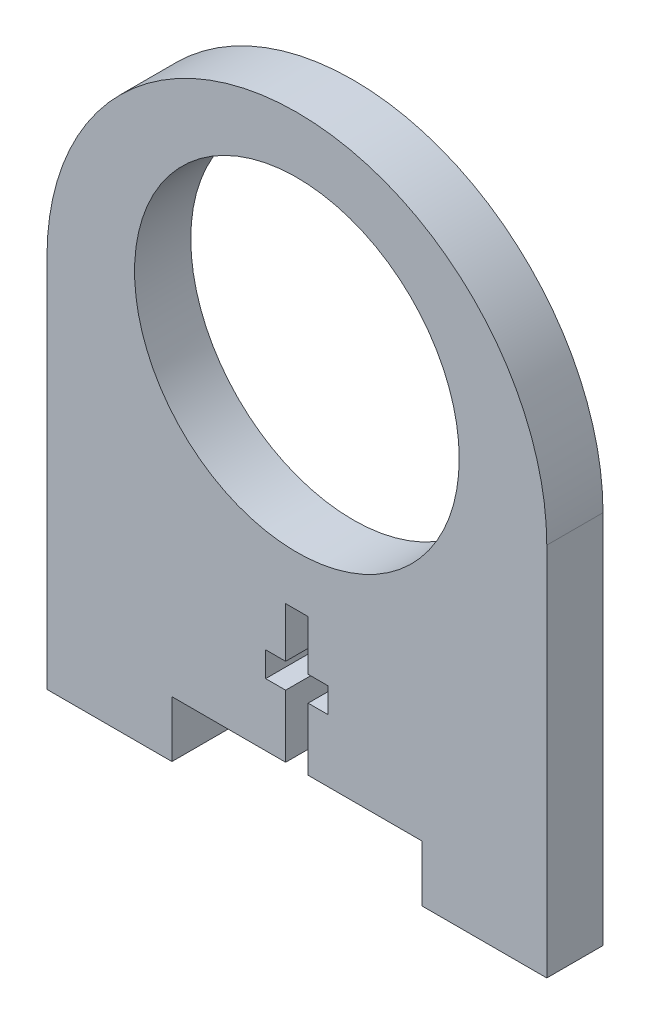
ISO-10303-21;
HEADER;
FILE_DESCRIPTION(('STEP AP214'),'2;1');
FILE_NAME('part.step','',(''),(''),'','','');
FILE_SCHEMA(('AUTOMOTIVE_DESIGN { 1 0 10303 214 1 1 1 1 }'));
ENDSEC;
DATA;
#1=APPLICATION_CONTEXT('core data for automotive mechanical design processes');
#2=APPLICATION_PROTOCOL_DEFINITION('international standard','automotive_design',2000,#1);
#3=PRODUCT_CONTEXT('',#1,'mechanical');
#4=PRODUCT('Part','Part','',(#3));
#5=PRODUCT_RELATED_PRODUCT_CATEGORY('part','',(#4));
#6=PRODUCT_DEFINITION_FORMATION('','',#4);
#7=PRODUCT_DEFINITION_CONTEXT('part definition',#1,'design');
#8=PRODUCT_DEFINITION('design','',#6,#7);
#9=PRODUCT_DEFINITION_SHAPE('','',#8);
#10=(LENGTH_UNIT() NAMED_UNIT(*) SI_UNIT(.MILLI.,.METRE.));
#11=(NAMED_UNIT(*) PLANE_ANGLE_UNIT() SI_UNIT($,.RADIAN.));
#12=(NAMED_UNIT(*) SI_UNIT($,.STERADIAN.) SOLID_ANGLE_UNIT());
#13=UNCERTAINTY_MEASURE_WITH_UNIT(LENGTH_MEASURE(1.E-05),#10,'distance_accuracy_value','');
#14=(GEOMETRIC_REPRESENTATION_CONTEXT(3) GLOBAL_UNCERTAINTY_ASSIGNED_CONTEXT((#13)) GLOBAL_UNIT_ASSIGNED_CONTEXT((#10,
#11,#12)) REPRESENTATION_CONTEXT('',''));
#15=CARTESIAN_POINT('',(0.,0.,0.));
#16=DIRECTION('',(0.,0.,1.));
#17=DIRECTION('',(1.,0.,0.));
#18=AXIS2_PLACEMENT_3D('',#15,#16,#17);
#19=CARTESIAN_POINT('',(-12.7,-13.335,-0.00100000000000013));
#20=DIRECTION('',(0.,1.,0.));
#21=DIRECTION('',(0.,0.,1.));
#22=AXIS2_PLACEMENT_3D('',#19,#20,#21);
#23=PLANE('',#22);
#24=DIRECTION('',(-1.,0.,0.));
#25=VECTOR('',#24,1.);
#26=CARTESIAN_POINT('',(-12.7,-13.335,5.715));
#27=LINE('',#26,#25);
#28=CARTESIAN_POINT('',(12.7,-13.335,5.715));
#29=VERTEX_POINT('',#28);
#30=CARTESIAN_POINT('',(1.14300000000002,-13.335,5.715));
#31=VERTEX_POINT('',#30);
#32=EDGE_CURVE('E190',#29,#31,#27,.T.);
#33=ORIENTED_EDGE('',*,*,#32,.T.);
#34=DIRECTION('',(0.,0.,1.));
#35=VECTOR('',#34,1.);
#36=CARTESIAN_POINT('',(1.14300000000002,-13.335,-0.00100000000000013));
#37=LINE('',#36,#35);
#38=CARTESIAN_POINT('',(1.14300000000002,-13.335,0.));
#39=VERTEX_POINT('',#38);
#40=EDGE_CURVE('E176',#39,#31,#37,.T.);
#41=ORIENTED_EDGE('',*,*,#40,.F.);
#42=DIRECTION('',(-1.,0.,0.));
#43=VECTOR('',#42,1.);
#44=CARTESIAN_POINT('',(-12.7,-13.335,0.));
#45=LINE('',#44,#43);
#46=CARTESIAN_POINT('',(12.7,-13.335,0.));
#47=VERTEX_POINT('',#46);
#48=EDGE_CURVE('E187',#47,#39,#45,.T.);
#49=ORIENTED_EDGE('',*,*,#48,.F.);
#50=DIRECTION('',(0.,0.,1.));
#51=VECTOR('',#50,1.);
#52=CARTESIAN_POINT('',(12.7,-13.335,-0.00100000000000013));
#53=LINE('',#52,#51);
#54=EDGE_CURVE('E58',#47,#29,#53,.T.);
#55=ORIENTED_EDGE('',*,*,#54,.T.);
#56=EDGE_LOOP('',(#33,#41,#49,#55));
#57=FACE_BOUND('',#56,.T.);
#58=ADVANCED_FACE('F35',(#57),#23,.F.);
#59=CARTESIAN_POINT('',(25.4,-19.05,5.715));
#60=DIRECTION('',(0.,1.,0.));
#61=DIRECTION('',(-1.,0.,0.));
#62=AXIS2_PLACEMENT_3D('',#59,#60,#61);
#63=PLANE('',#62);
#64=DIRECTION('',(1.,0.,0.));
#65=VECTOR('',#64,1.);
#66=CARTESIAN_POINT('',(25.4,-19.05,0.));
#67=LINE('',#66,#65);
#68=CARTESIAN_POINT('',(-25.4,-19.05,0.));
#69=VERTEX_POINT('',#68);
#70=CARTESIAN_POINT('',(-12.7,-19.05,0.));
#71=VERTEX_POINT('',#70);
#72=EDGE_CURVE('E245',#69,#71,#67,.T.);
#73=ORIENTED_EDGE('',*,*,#72,.T.);
#74=DIRECTION('',(0.,0.,1.));
#75=VECTOR('',#74,1.);
#76=CARTESIAN_POINT('',(-12.7,-19.05,-0.00100000000000013));
#77=LINE('',#76,#75);
#78=CARTESIAN_POINT('',(-12.7,-19.05,5.715));
#79=VERTEX_POINT('',#78);
#80=EDGE_CURVE('E211',#71,#79,#77,.T.);
#81=ORIENTED_EDGE('',*,*,#80,.T.);
#82=DIRECTION('',(1.,0.,0.));
#83=VECTOR('',#82,1.);
#84=CARTESIAN_POINT('',(25.4,-19.05,5.715));
#85=LINE('',#84,#83);
#86=CARTESIAN_POINT('',(-25.4,-19.05,5.715));
#87=VERTEX_POINT('',#86);
#88=EDGE_CURVE('E234',#87,#79,#85,.T.);
#89=ORIENTED_EDGE('',*,*,#88,.F.);
#90=DIRECTION('',(0.,0.,-1.));
#91=VECTOR('',#90,1.);
#92=CARTESIAN_POINT('',(-25.4,-19.05,5.715));
#93=LINE('',#92,#91);
#94=EDGE_CURVE('E43',#87,#69,#93,.T.);
#95=ORIENTED_EDGE('',*,*,#94,.T.);
#96=EDGE_LOOP('',(#73,#81,#89,#95));
#97=FACE_BOUND('',#96,.T.);
#98=ADVANCED_FACE('F258',(#97),#63,.F.);
#99=CARTESIAN_POINT('',(0.,19.05,5.715));
#100=DIRECTION('',(0.,0.,-1.));
#101=DIRECTION('',(-1.,0.,0.));
#102=AXIS2_PLACEMENT_3D('',#99,#100,#101);
#103=CYLINDRICAL_SURFACE('',#102,25.4);
#104=CARTESIAN_POINT('',(0.,19.05,0.));
#105=DIRECTION('',(0.,0.,1.));
#106=DIRECTION('',(-1.,0.,0.));
#107=AXIS2_PLACEMENT_3D('',#104,#105,#106);
#108=CIRCLE('',#107,25.4);
#109=CARTESIAN_POINT('',(25.4,19.05,0.));
#110=VERTEX_POINT('',#109);
#111=CARTESIAN_POINT('',(-25.4,19.05,0.));
#112=VERTEX_POINT('',#111);
#113=EDGE_CURVE('E224',#110,#112,#108,.T.);
#114=ORIENTED_EDGE('',*,*,#113,.T.);
#115=DIRECTION('',(0.,0.,-1.));
#116=VECTOR('',#115,1.);
#117=CARTESIAN_POINT('',(-25.4,19.05,5.715));
#118=LINE('',#117,#116);
#119=CARTESIAN_POINT('',(-25.4,19.05,5.715));
#120=VERTEX_POINT('',#119);
#121=EDGE_CURVE('E11',#120,#112,#118,.T.);
#122=ORIENTED_EDGE('',*,*,#121,.F.);
#123=CARTESIAN_POINT('',(0.,19.05,5.715));
#124=DIRECTION('',(0.,0.,1.));
#125=DIRECTION('',(-1.,0.,0.));
#126=AXIS2_PLACEMENT_3D('',#123,#124,#125);
#127=CIRCLE('',#126,25.4);
#128=CARTESIAN_POINT('',(25.4,19.05,5.715));
#129=VERTEX_POINT('',#128);
#130=EDGE_CURVE('E227',#129,#120,#127,.T.);
#131=ORIENTED_EDGE('',*,*,#130,.F.);
#132=DIRECTION('',(0.,0.,-1.));
#133=VECTOR('',#132,1.);
#134=CARTESIAN_POINT('',(25.4,19.05,5.715));
#135=LINE('',#134,#133);
#136=EDGE_CURVE('E239',#129,#110,#135,.T.);
#137=ORIENTED_EDGE('',*,*,#136,.T.);
#138=EDGE_LOOP('',(#114,#122,#131,#137));
#139=FACE_BOUND('',#138,.T.);
#140=ADVANCED_FACE('F37',(#139),#103,.T.);
#141=CARTESIAN_POINT('',(-25.4,-19.05,5.715));
#142=DIRECTION('',(1.,0.,0.));
#143=DIRECTION('',(0.,1.,0.));
#144=AXIS2_PLACEMENT_3D('',#141,#142,#143);
#145=PLANE('',#144);
#146=DIRECTION('',(0.,-1.,0.));
#147=VECTOR('',#146,1.);
#148=CARTESIAN_POINT('',(-25.4,-19.05,0.));
#149=LINE('',#148,#147);
#150=EDGE_CURVE('E242',#112,#69,#149,.T.);
#151=ORIENTED_EDGE('',*,*,#150,.T.);
#152=ORIENTED_EDGE('',*,*,#94,.F.);
#153=DIRECTION('',(0.,-1.,0.));
#154=VECTOR('',#153,1.);
#155=CARTESIAN_POINT('',(-25.4,-19.05,5.715));
#156=LINE('',#155,#154);
#157=EDGE_CURVE('E230',#120,#87,#156,.T.);
#158=ORIENTED_EDGE('',*,*,#157,.F.);
#159=ORIENTED_EDGE('',*,*,#121,.T.);
#160=EDGE_LOOP('',(#151,#152,#158,#159));
#161=FACE_BOUND('',#160,.T.);
#162=ADVANCED_FACE('F277',(#161),#145,.F.);
#163=CARTESIAN_POINT('',(12.7,-19.05,5.715));
#164=VERTEX_POINT('',#163);
#165=CARTESIAN_POINT('',(25.4,-19.05,5.715));
#166=VERTEX_POINT('',#165);
#167=EDGE_CURVE('E233',#164,#166,#85,.T.);
#168=ORIENTED_EDGE('',*,*,#167,.F.);
#169=DIRECTION('',(0.,0.,1.));
#170=VECTOR('',#169,1.);
#171=CARTESIAN_POINT('',(12.7,-19.05,-0.00100000000000013));
#172=LINE('',#171,#170);
#173=CARTESIAN_POINT('',(12.7,-19.05,0.));
#174=VERTEX_POINT('',#173);
#175=EDGE_CURVE('E217',#174,#164,#172,.T.);
#176=ORIENTED_EDGE('',*,*,#175,.F.);
#177=CARTESIAN_POINT('',(25.4,-19.05,0.));
#178=VERTEX_POINT('',#177);
#179=EDGE_CURVE('E244',#174,#178,#67,.T.);
#180=ORIENTED_EDGE('',*,*,#179,.T.);
#181=DIRECTION('',(0.,0.,-1.));
#182=VECTOR('',#181,1.);
#183=CARTESIAN_POINT('',(25.4,-19.05,5.715));
#184=LINE('',#183,#182);
#185=EDGE_CURVE('E251',#166,#178,#184,.T.);
#186=ORIENTED_EDGE('',*,*,#185,.F.);
#187=EDGE_LOOP('',(#168,#176,#180,#186));
#188=FACE_BOUND('',#187,.T.);
#189=ADVANCED_FACE('F287',(#188),#63,.F.);
#190=CARTESIAN_POINT('',(25.4,-19.05,5.715));
#191=DIRECTION('',(-1.,0.,0.));
#192=DIRECTION('',(0.,0.,1.));
#193=AXIS2_PLACEMENT_3D('',#190,#191,#192);
#194=PLANE('',#193);
#195=DIRECTION('',(0.,1.,0.));
#196=VECTOR('',#195,1.);
#197=CARTESIAN_POINT('',(25.4,-19.05,0.));
#198=LINE('',#197,#196);
#199=EDGE_CURVE('E231',#178,#110,#198,.T.);
#200=ORIENTED_EDGE('',*,*,#199,.T.);
#201=ORIENTED_EDGE('',*,*,#136,.F.);
#202=DIRECTION('',(0.,1.,0.));
#203=VECTOR('',#202,1.);
#204=CARTESIAN_POINT('',(25.4,-19.05,5.715));
#205=LINE('',#204,#203);
#206=EDGE_CURVE('E237',#166,#129,#205,.T.);
#207=ORIENTED_EDGE('',*,*,#206,.F.);
#208=ORIENTED_EDGE('',*,*,#185,.T.);
#209=EDGE_LOOP('',(#200,#201,#207,#208));
#210=FACE_BOUND('',#209,.T.);
#211=ADVANCED_FACE('F282',(#210),#194,.F.);
#212=CARTESIAN_POINT('',(0.,19.05,5.715));
#213=DIRECTION('',(0.,0.,-1.));
#214=DIRECTION('',(-1.,0.,0.));
#215=AXIS2_PLACEMENT_3D('',#212,#213,#214);
#216=PLANE('',#215);
#217=CARTESIAN_POINT('',(0.,22.21484,5.715));
#218=DIRECTION('',(0.,0.,1.));
#219=DIRECTION('',(1.,0.,0.));
#220=AXIS2_PLACEMENT_3D('',#217,#218,#219);
#221=CIRCLE('',#220,16.5);
#222=CARTESIAN_POINT('',(16.5,22.21484,5.715));
#223=VERTEX_POINT('',#222);
#224=EDGE_CURVE('E221',#223,#223,#221,.T.);
#225=ORIENTED_EDGE('',*,*,#224,.F.);
#226=EDGE_LOOP('',(#225));
#227=FACE_BOUND('',#226,.T.);
#228=DIRECTION('',(1.,0.,0.));
#229=VECTOR('',#228,1.);
#230=CARTESIAN_POINT('',(3.175,-6.985,5.715));
#231=LINE('',#230,#229);
#232=CARTESIAN_POINT('',(1.143,-6.985,5.715));
#233=VERTEX_POINT('',#232);
#234=CARTESIAN_POINT('',(3.175,-6.985,5.715));
#235=VERTEX_POINT('',#234);
#236=EDGE_CURVE('E294',#233,#235,#231,.T.);
#237=ORIENTED_EDGE('',*,*,#236,.F.);
#238=DIRECTION('',(0.,1.,0.));
#239=VECTOR('',#238,1.);
#240=CARTESIAN_POINT('',(1.14300000000002,-13.335,5.715));
#241=LINE('',#240,#239);
#242=EDGE_CURVE('E291',#31,#233,#241,.T.);
#243=ORIENTED_EDGE('',*,*,#242,.F.);
#244=ORIENTED_EDGE('',*,*,#32,.F.);
#245=DIRECTION('',(0.,1.,0.));
#246=VECTOR('',#245,1.);
#247=CARTESIAN_POINT('',(12.7,-19.05,5.715));
#248=LINE('',#247,#246);
#249=EDGE_CURVE('E207',#164,#29,#248,.T.);
#250=ORIENTED_EDGE('',*,*,#249,.F.);
#251=ORIENTED_EDGE('',*,*,#167,.T.);
#252=ORIENTED_EDGE('',*,*,#206,.T.);
#253=ORIENTED_EDGE('',*,*,#130,.T.);
#254=ORIENTED_EDGE('',*,*,#157,.T.);
#255=ORIENTED_EDGE('',*,*,#88,.T.);
#256=DIRECTION('',(0.,-1.,0.));
#257=VECTOR('',#256,1.);
#258=CARTESIAN_POINT('',(-12.7,-19.05,5.715));
#259=LINE('',#258,#257);
#260=CARTESIAN_POINT('',(-12.7,-13.335,5.715));
#261=VERTEX_POINT('',#260);
#262=EDGE_CURVE('E201',#261,#79,#259,.T.);
#263=ORIENTED_EDGE('',*,*,#262,.F.);
#264=CARTESIAN_POINT('',(-1.14300000000001,-13.335,5.715));
#265=VERTEX_POINT('',#264);
#266=EDGE_CURVE('E209',#265,#261,#27,.T.);
#267=ORIENTED_EDGE('',*,*,#266,.F.);
#268=DIRECTION('',(0.,-1.,0.));
#269=VECTOR('',#268,1.);
#270=CARTESIAN_POINT('',(-1.14300000000001,-13.335,5.715));
#271=LINE('',#270,#269);
#272=CARTESIAN_POINT('',(-1.14300000000001,-6.985,5.715));
#273=VERTEX_POINT('',#272);
#274=EDGE_CURVE('E50',#273,#265,#271,.T.);
#275=ORIENTED_EDGE('',*,*,#274,.F.);
#276=DIRECTION('',(1.,0.,0.));
#277=VECTOR('',#276,1.);
#278=CARTESIAN_POINT('',(-1.14300000000001,-6.985,5.715));
#279=LINE('',#278,#277);
#280=CARTESIAN_POINT('',(-3.175,-6.985,5.715));
#281=VERTEX_POINT('',#280);
#282=EDGE_CURVE('E298',#281,#273,#279,.T.);
#283=ORIENTED_EDGE('',*,*,#282,.F.);
#284=DIRECTION('',(0.,-1.,0.));
#285=VECTOR('',#284,1.);
#286=CARTESIAN_POINT('',(-3.175,-6.985,5.715));
#287=LINE('',#286,#285);
#288=CARTESIAN_POINT('',(-3.175,-4.445,5.715));
#289=VERTEX_POINT('',#288);
#290=EDGE_CURVE('E354',#289,#281,#287,.T.);
#291=ORIENTED_EDGE('',*,*,#290,.F.);
#292=DIRECTION('',(-1.,0.,0.));
#293=VECTOR('',#292,1.);
#294=CARTESIAN_POINT('',(-1.14300000000001,-4.445,5.715));
#295=LINE('',#294,#293);
#296=CARTESIAN_POINT('',(-1.14300000000001,-4.445,5.715));
#297=VERTEX_POINT('',#296);
#298=EDGE_CURVE('E182',#297,#289,#295,.T.);
#299=ORIENTED_EDGE('',*,*,#298,.F.);
#300=DIRECTION('',(0.,-1.,0.));
#301=VECTOR('',#300,1.);
#302=CARTESIAN_POINT('',(-1.14300000000001,-4.445,5.715));
#303=LINE('',#302,#301);
#304=CARTESIAN_POINT('',(-1.14300000000001,0.635000000000004,5.715));
#305=VERTEX_POINT('',#304);
#306=EDGE_CURVE('E313',#305,#297,#303,.T.);
#307=ORIENTED_EDGE('',*,*,#306,.F.);
#308=DIRECTION('',(-1.,0.,0.));
#309=VECTOR('',#308,1.);
#310=CARTESIAN_POINT('',(-1.14300000000001,0.635000000000004,5.715));
#311=LINE('',#310,#309);
#312=CARTESIAN_POINT('',(1.14299999999999,0.635000000000003,5.715));
#313=VERTEX_POINT('',#312);
#314=EDGE_CURVE('E310',#313,#305,#311,.T.);
#315=ORIENTED_EDGE('',*,*,#314,.F.);
#316=DIRECTION('',(0.,1.,0.));
#317=VECTOR('',#316,1.);
#318=CARTESIAN_POINT('',(1.143,-4.445,5.715));
#319=LINE('',#318,#317);
#320=CARTESIAN_POINT('',(1.143,-4.445,5.715));
#321=VERTEX_POINT('',#320);
#322=EDGE_CURVE('E307',#321,#313,#319,.T.);
#323=ORIENTED_EDGE('',*,*,#322,.F.);
#324=DIRECTION('',(-1.,0.,0.));
#325=VECTOR('',#324,1.);
#326=CARTESIAN_POINT('',(3.175,-4.445,5.715));
#327=LINE('',#326,#325);
#328=CARTESIAN_POINT('',(3.175,-4.445,5.715));
#329=VERTEX_POINT('',#328);
#330=EDGE_CURVE('E304',#329,#321,#327,.T.);
#331=ORIENTED_EDGE('',*,*,#330,.F.);
#332=DIRECTION('',(0.,1.,0.));
#333=VECTOR('',#332,1.);
#334=CARTESIAN_POINT('',(3.175,-6.985,5.715));
#335=LINE('',#334,#333);
#336=EDGE_CURVE('E296',#235,#329,#335,.T.);
#337=ORIENTED_EDGE('',*,*,#336,.F.);
#338=EDGE_LOOP('',(#237,#243,#244,#250,#251,#252,#253,#254,#255,#263,#267,#275,#283,#291,#299,
#307,#315,#323,#331,#337));
#339=FACE_BOUND('',#338,.T.);
#340=ADVANCED_FACE('F273',(#227,#339),#216,.F.);
#341=CARTESIAN_POINT('',(0.,19.05,0.));
#342=DIRECTION('',(0.,0.,-1.));
#343=DIRECTION('',(-1.,0.,0.));
#344=AXIS2_PLACEMENT_3D('',#341,#342,#343);
#345=PLANE('',#344);
#346=DIRECTION('',(0.,1.,0.));
#347=VECTOR('',#346,1.);
#348=CARTESIAN_POINT('',(1.14300000000002,-13.335,0.));
#349=LINE('',#348,#347);
#350=CARTESIAN_POINT('',(1.143,-6.985,0.));
#351=VERTEX_POINT('',#350);
#352=EDGE_CURVE('E172',#39,#351,#349,.T.);
#353=ORIENTED_EDGE('',*,*,#352,.T.);
#354=DIRECTION('',(1.,0.,0.));
#355=VECTOR('',#354,1.);
#356=CARTESIAN_POINT('',(3.175,-6.985,0.));
#357=LINE('',#356,#355);
#358=CARTESIAN_POINT('',(3.175,-6.985,0.));
#359=VERTEX_POINT('',#358);
#360=EDGE_CURVE('E183',#351,#359,#357,.T.);
#361=ORIENTED_EDGE('',*,*,#360,.T.);
#362=DIRECTION('',(0.,1.,0.));
#363=VECTOR('',#362,1.);
#364=CARTESIAN_POINT('',(3.175,-6.985,0.));
#365=LINE('',#364,#363);
#366=CARTESIAN_POINT('',(3.175,-4.445,0.));
#367=VERTEX_POINT('',#366);
#368=EDGE_CURVE('E360',#359,#367,#365,.T.);
#369=ORIENTED_EDGE('',*,*,#368,.T.);
#370=DIRECTION('',(-1.,0.,0.));
#371=VECTOR('',#370,1.);
#372=CARTESIAN_POINT('',(3.175,-4.445,0.));
#373=LINE('',#372,#371);
#374=CARTESIAN_POINT('',(1.143,-4.445,0.));
#375=VERTEX_POINT('',#374);
#376=EDGE_CURVE('E363',#367,#375,#373,.T.);
#377=ORIENTED_EDGE('',*,*,#376,.T.);
#378=DIRECTION('',(0.,1.,0.));
#379=VECTOR('',#378,1.);
#380=CARTESIAN_POINT('',(1.143,-4.445,0.));
#381=LINE('',#380,#379);
#382=CARTESIAN_POINT('',(1.14299999999999,0.635000000000003,0.));
#383=VERTEX_POINT('',#382);
#384=EDGE_CURVE('E366',#375,#383,#381,.T.);
#385=ORIENTED_EDGE('',*,*,#384,.T.);
#386=DIRECTION('',(-1.,0.,0.));
#387=VECTOR('',#386,1.);
#388=CARTESIAN_POINT('',(-1.14300000000001,0.635000000000004,0.));
#389=LINE('',#388,#387);
#390=CARTESIAN_POINT('',(-1.14300000000001,0.635000000000004,0.));
#391=VERTEX_POINT('',#390);
#392=EDGE_CURVE('E369',#383,#391,#389,.T.);
#393=ORIENTED_EDGE('',*,*,#392,.T.);
#394=DIRECTION('',(0.,-1.,0.));
#395=VECTOR('',#394,1.);
#396=CARTESIAN_POINT('',(-1.14300000000001,-4.445,0.));
#397=LINE('',#396,#395);
#398=CARTESIAN_POINT('',(-1.14300000000001,-4.445,0.));
#399=VERTEX_POINT('',#398);
#400=EDGE_CURVE('E372',#391,#399,#397,.T.);
#401=ORIENTED_EDGE('',*,*,#400,.T.);
#402=DIRECTION('',(-1.,0.,0.));
#403=VECTOR('',#402,1.);
#404=CARTESIAN_POINT('',(-1.14300000000001,-4.445,0.));
#405=LINE('',#404,#403);
#406=CARTESIAN_POINT('',(-3.175,-4.445,0.));
#407=VERTEX_POINT('',#406);
#408=EDGE_CURVE('E341',#399,#407,#405,.T.);
#409=ORIENTED_EDGE('',*,*,#408,.T.);
#410=DIRECTION('',(0.,-1.,0.));
#411=VECTOR('',#410,1.);
#412=CARTESIAN_POINT('',(-3.175,-6.985,0.));
#413=LINE('',#412,#411);
#414=CARTESIAN_POINT('',(-3.175,-6.985,0.));
#415=VERTEX_POINT('',#414);
#416=EDGE_CURVE('E319',#407,#415,#413,.T.);
#417=ORIENTED_EDGE('',*,*,#416,.T.);
#418=DIRECTION('',(1.,0.,0.));
#419=VECTOR('',#418,1.);
#420=CARTESIAN_POINT('',(-1.14300000000001,-6.985,0.));
#421=LINE('',#420,#419);
#422=CARTESIAN_POINT('',(-1.14300000000001,-6.985,0.));
#423=VERTEX_POINT('',#422);
#424=EDGE_CURVE('E339',#415,#423,#421,.T.);
#425=ORIENTED_EDGE('',*,*,#424,.T.);
#426=DIRECTION('',(0.,-1.,0.));
#427=VECTOR('',#426,1.);
#428=CARTESIAN_POINT('',(-1.14300000000001,-13.335,0.));
#429=LINE('',#428,#427);
#430=CARTESIAN_POINT('',(-1.14300000000001,-13.335,0.));
#431=VERTEX_POINT('',#430);
#432=EDGE_CURVE('E375',#423,#431,#429,.T.);
#433=ORIENTED_EDGE('',*,*,#432,.T.);
#434=CARTESIAN_POINT('',(-12.7,-13.335,0.));
#435=VERTEX_POINT('',#434);
#436=EDGE_CURVE('E198',#431,#435,#45,.T.);
#437=ORIENTED_EDGE('',*,*,#436,.T.);
#438=DIRECTION('',(0.,-1.,0.));
#439=VECTOR('',#438,1.);
#440=CARTESIAN_POINT('',(-12.7,-19.05,0.));
#441=LINE('',#440,#439);
#442=EDGE_CURVE('E197',#435,#71,#441,.T.);
#443=ORIENTED_EDGE('',*,*,#442,.T.);
#444=ORIENTED_EDGE('',*,*,#72,.F.);
#445=ORIENTED_EDGE('',*,*,#150,.F.);
#446=ORIENTED_EDGE('',*,*,#113,.F.);
#447=ORIENTED_EDGE('',*,*,#199,.F.);
#448=ORIENTED_EDGE('',*,*,#179,.F.);
#449=DIRECTION('',(0.,1.,0.));
#450=VECTOR('',#449,1.);
#451=CARTESIAN_POINT('',(12.7,-19.05,0.));
#452=LINE('',#451,#450);
#453=EDGE_CURVE('E196',#174,#47,#452,.T.);
#454=ORIENTED_EDGE('',*,*,#453,.T.);
#455=ORIENTED_EDGE('',*,*,#48,.T.);
#456=EDGE_LOOP('',(#353,#361,#369,#377,#385,#393,#401,#409,#417,#425,#433,#437,#443,#444,#445,
#446,#447,#448,#454,#455));
#457=FACE_BOUND('',#456,.T.);
#458=CARTESIAN_POINT('',(0.,22.21484,0.));
#459=DIRECTION('',(0.,0.,-1.));
#460=DIRECTION('',(-1.,0.,0.));
#461=AXIS2_PLACEMENT_3D('',#458,#459,#460);
#462=CIRCLE('',#461,16.5);
#463=CARTESIAN_POINT('',(-16.5,22.21484,0.));
#464=VERTEX_POINT('',#463);
#465=EDGE_CURVE('E215',#464,#464,#462,.F.);
#466=ORIENTED_EDGE('',*,*,#465,.T.);
#467=EDGE_LOOP('',(#466));
#468=FACE_BOUND('',#467,.T.);
#469=ADVANCED_FACE('F193',(#457,#468),#345,.T.);
#470=CARTESIAN_POINT('',(0.,22.21484,-0.00100000000000013));
#471=DIRECTION('',(0.,0.,1.));
#472=DIRECTION('',(1.,0.,0.));
#473=AXIS2_PLACEMENT_3D('',#470,#471,#472);
#474=CYLINDRICAL_SURFACE('',#473,16.5);
#475=ORIENTED_EDGE('',*,*,#465,.F.);
#476=EDGE_LOOP('',(#475));
#477=FACE_BOUND('',#476,.T.);
#478=ORIENTED_EDGE('',*,*,#224,.T.);
#479=EDGE_LOOP('',(#478));
#480=FACE_BOUND('',#479,.T.);
#481=ADVANCED_FACE('F402',(#477,#480),#474,.F.);
#482=CARTESIAN_POINT('',(-12.7,-19.05,-0.00100000000000013));
#483=DIRECTION('',(-1.,0.,0.));
#484=DIRECTION('',(0.,0.,1.));
#485=AXIS2_PLACEMENT_3D('',#482,#483,#484);
#486=PLANE('',#485);
#487=DIRECTION('',(0.,0.,1.));
#488=VECTOR('',#487,1.);
#489=CARTESIAN_POINT('',(-12.7,-13.335,-0.00100000000000013));
#490=LINE('',#489,#488);
#491=EDGE_CURVE('E212',#435,#261,#490,.T.);
#492=ORIENTED_EDGE('',*,*,#491,.T.);
#493=ORIENTED_EDGE('',*,*,#262,.T.);
#494=ORIENTED_EDGE('',*,*,#80,.F.);
#495=ORIENTED_EDGE('',*,*,#442,.F.);
#496=EDGE_LOOP('',(#492,#493,#494,#495));
#497=FACE_BOUND('',#496,.T.);
#498=ADVANCED_FACE('F266',(#497),#486,.F.);
#499=ORIENTED_EDGE('',*,*,#436,.F.);
#500=DIRECTION('',(0.,0.,1.));
#501=VECTOR('',#500,1.);
#502=CARTESIAN_POINT('',(-1.14300000000001,-13.335,-0.00100000000000013));
#503=LINE('',#502,#501);
#504=EDGE_CURVE('E191',#431,#265,#503,.T.);
#505=ORIENTED_EDGE('',*,*,#504,.T.);
#506=ORIENTED_EDGE('',*,*,#266,.T.);
#507=ORIENTED_EDGE('',*,*,#491,.F.);
#508=EDGE_LOOP('',(#499,#505,#506,#507));
#509=FACE_BOUND('',#508,.T.);
#510=ADVANCED_FACE('F269',(#509),#23,.F.);
#511=CARTESIAN_POINT('',(12.7,-19.05,-0.00100000000000013));
#512=DIRECTION('',(1.,0.,0.));
#513=DIRECTION('',(0.,0.,-1.));
#514=AXIS2_PLACEMENT_3D('',#511,#512,#513);
#515=PLANE('',#514);
#516=ORIENTED_EDGE('',*,*,#175,.T.);
#517=ORIENTED_EDGE('',*,*,#249,.T.);
#518=ORIENTED_EDGE('',*,*,#54,.F.);
#519=ORIENTED_EDGE('',*,*,#453,.F.);
#520=EDGE_LOOP('',(#516,#517,#518,#519));
#521=FACE_BOUND('',#520,.T.);
#522=ADVANCED_FACE('F290',(#521),#515,.F.);
#523=CARTESIAN_POINT('',(-1.14300000000001,-4.445,-0.00100000000000013));
#524=DIRECTION('',(0.,1.,0.));
#525=DIRECTION('',(0.,0.,1.));
#526=AXIS2_PLACEMENT_3D('',#523,#524,#525);
#527=PLANE('',#526);
#528=DIRECTION('',(0.,0.,1.));
#529=VECTOR('',#528,1.);
#530=CARTESIAN_POINT('',(-1.14300000000001,-4.445,-0.00100000000000013));
#531=LINE('',#530,#529);
#532=EDGE_CURVE('E317',#399,#297,#531,.T.);
#533=ORIENTED_EDGE('',*,*,#532,.T.);
#534=ORIENTED_EDGE('',*,*,#298,.T.);
#535=DIRECTION('',(0.,0.,1.));
#536=VECTOR('',#535,1.);
#537=CARTESIAN_POINT('',(-3.175,-4.445,-0.00100000000000013));
#538=LINE('',#537,#536);
#539=EDGE_CURVE('E316',#407,#289,#538,.T.);
#540=ORIENTED_EDGE('',*,*,#539,.F.);
#541=ORIENTED_EDGE('',*,*,#408,.F.);
#542=EDGE_LOOP('',(#533,#534,#540,#541));
#543=FACE_BOUND('',#542,.T.);
#544=ADVANCED_FACE('F349',(#543),#527,.F.);
#545=CARTESIAN_POINT('',(-1.14300000000001,-4.445,-0.00100000000000013));
#546=DIRECTION('',(-1.,0.,0.));
#547=DIRECTION('',(0.,-1.,0.));
#548=AXIS2_PLACEMENT_3D('',#545,#546,#547);
#549=PLANE('',#548);
#550=DIRECTION('',(0.,0.,1.));
#551=VECTOR('',#550,1.);
#552=CARTESIAN_POINT('',(-1.14300000000001,0.635000000000004,-0.00100000000000013));
#553=LINE('',#552,#551);
#554=EDGE_CURVE('E320',#391,#305,#553,.T.);
#555=ORIENTED_EDGE('',*,*,#554,.T.);
#556=ORIENTED_EDGE('',*,*,#306,.T.);
#557=ORIENTED_EDGE('',*,*,#532,.F.);
#558=ORIENTED_EDGE('',*,*,#400,.F.);
#559=EDGE_LOOP('',(#555,#556,#557,#558));
#560=FACE_BOUND('',#559,.T.);
#561=ADVANCED_FACE('F478',(#560),#549,.F.);
#562=CARTESIAN_POINT('',(-1.14300000000001,0.635000000000004,-0.00100000000000013));
#563=DIRECTION('',(0.,1.,0.));
#564=DIRECTION('',(-1.,0.,0.));
#565=AXIS2_PLACEMENT_3D('',#562,#563,#564);
#566=PLANE('',#565);
#567=DIRECTION('',(0.,0.,1.));
#568=VECTOR('',#567,1.);
#569=CARTESIAN_POINT('',(1.14299999999999,0.635000000000003,-0.00100000000000013));
#570=LINE('',#569,#568);
#571=EDGE_CURVE('E322',#383,#313,#570,.T.);
#572=ORIENTED_EDGE('',*,*,#571,.T.);
#573=ORIENTED_EDGE('',*,*,#314,.T.);
#574=ORIENTED_EDGE('',*,*,#554,.F.);
#575=ORIENTED_EDGE('',*,*,#392,.F.);
#576=EDGE_LOOP('',(#572,#573,#574,#575));
#577=FACE_BOUND('',#576,.T.);
#578=ADVANCED_FACE('F486',(#577),#566,.F.);
#579=CARTESIAN_POINT('',(1.143,-4.445,-0.00100000000000013));
#580=DIRECTION('',(1.,0.,0.));
#581=DIRECTION('',(0.,1.,0.));
#582=AXIS2_PLACEMENT_3D('',#579,#580,#581);
#583=PLANE('',#582);
#584=DIRECTION('',(0.,0.,1.));
#585=VECTOR('',#584,1.);
#586=CARTESIAN_POINT('',(1.143,-4.445,-0.00100000000000013));
#587=LINE('',#586,#585);
#588=EDGE_CURVE('E324',#375,#321,#587,.T.);
#589=ORIENTED_EDGE('',*,*,#588,.T.);
#590=ORIENTED_EDGE('',*,*,#322,.T.);
#591=ORIENTED_EDGE('',*,*,#571,.F.);
#592=ORIENTED_EDGE('',*,*,#384,.F.);
#593=EDGE_LOOP('',(#589,#590,#591,#592));
#594=FACE_BOUND('',#593,.T.);
#595=ADVANCED_FACE('F496',(#594),#583,.F.);
#596=CARTESIAN_POINT('',(3.175,-4.445,-0.00100000000000013));
#597=DIRECTION('',(0.,1.,0.));
#598=DIRECTION('',(0.,0.,1.));
#599=AXIS2_PLACEMENT_3D('',#596,#597,#598);
#600=PLANE('',#599);
#601=DIRECTION('',(0.,0.,1.));
#602=VECTOR('',#601,1.);
#603=CARTESIAN_POINT('',(3.175,-4.445,-0.00100000000000013));
#604=LINE('',#603,#602);
#605=EDGE_CURVE('E326',#367,#329,#604,.T.);
#606=ORIENTED_EDGE('',*,*,#605,.T.);
#607=ORIENTED_EDGE('',*,*,#330,.T.);
#608=ORIENTED_EDGE('',*,*,#588,.F.);
#609=ORIENTED_EDGE('',*,*,#376,.F.);
#610=EDGE_LOOP('',(#606,#607,#608,#609));
#611=FACE_BOUND('',#610,.T.);
#612=ADVANCED_FACE('F506',(#611),#600,.F.);
#613=CARTESIAN_POINT('',(3.175,-6.985,-0.00100000000000013));
#614=DIRECTION('',(1.,0.,0.));
#615=DIRECTION('',(0.,1.,0.));
#616=AXIS2_PLACEMENT_3D('',#613,#614,#615);
#617=PLANE('',#616);
#618=DIRECTION('',(0.,0.,1.));
#619=VECTOR('',#618,1.);
#620=CARTESIAN_POINT('',(3.175,-6.985,-0.00100000000000013));
#621=LINE('',#620,#619);
#622=EDGE_CURVE('E328',#359,#235,#621,.T.);
#623=ORIENTED_EDGE('',*,*,#622,.T.);
#624=ORIENTED_EDGE('',*,*,#336,.T.);
#625=ORIENTED_EDGE('',*,*,#605,.F.);
#626=ORIENTED_EDGE('',*,*,#368,.F.);
#627=EDGE_LOOP('',(#623,#624,#625,#626));
#628=FACE_BOUND('',#627,.T.);
#629=ADVANCED_FACE('F516',(#628),#617,.F.);
#630=CARTESIAN_POINT('',(3.175,-6.985,-0.00100000000000013));
#631=DIRECTION('',(0.,-1.,0.));
#632=DIRECTION('',(0.,0.,-1.));
#633=AXIS2_PLACEMENT_3D('',#630,#631,#632);
#634=PLANE('',#633);
#635=DIRECTION('',(0.,0.,1.));
#636=VECTOR('',#635,1.);
#637=CARTESIAN_POINT('',(1.143,-6.985,-0.00100000000000013));
#638=LINE('',#637,#636);
#639=EDGE_CURVE('E178',#351,#233,#638,.T.);
#640=ORIENTED_EDGE('',*,*,#639,.T.);
#641=ORIENTED_EDGE('',*,*,#236,.T.);
#642=ORIENTED_EDGE('',*,*,#622,.F.);
#643=ORIENTED_EDGE('',*,*,#360,.F.);
#644=EDGE_LOOP('',(#640,#641,#642,#643));
#645=FACE_BOUND('',#644,.T.);
#646=ADVANCED_FACE('F526',(#645),#634,.F.);
#647=CARTESIAN_POINT('',(1.14300000000002,-13.335,-0.00100000000000013));
#648=DIRECTION('',(1.,0.,0.));
#649=DIRECTION('',(0.,1.,0.));
#650=AXIS2_PLACEMENT_3D('',#647,#648,#649);
#651=PLANE('',#650);
#652=ORIENTED_EDGE('',*,*,#40,.T.);
#653=ORIENTED_EDGE('',*,*,#242,.T.);
#654=ORIENTED_EDGE('',*,*,#639,.F.);
#655=ORIENTED_EDGE('',*,*,#352,.F.);
#656=EDGE_LOOP('',(#652,#653,#654,#655));
#657=FACE_BOUND('',#656,.T.);
#658=ADVANCED_FACE('F174',(#657),#651,.F.);
#659=CARTESIAN_POINT('',(-1.14300000000001,-13.335,-0.00100000000000013));
#660=DIRECTION('',(-1.,0.,0.));
#661=DIRECTION('',(0.,-1.,0.));
#662=AXIS2_PLACEMENT_3D('',#659,#660,#661);
#663=PLANE('',#662);
#664=DIRECTION('',(0.,0.,1.));
#665=VECTOR('',#664,1.);
#666=CARTESIAN_POINT('',(-1.14300000000001,-6.985,-0.00100000000000013));
#667=LINE('',#666,#665);
#668=EDGE_CURVE('E332',#423,#273,#667,.T.);
#669=ORIENTED_EDGE('',*,*,#668,.T.);
#670=ORIENTED_EDGE('',*,*,#274,.T.);
#671=ORIENTED_EDGE('',*,*,#504,.F.);
#672=ORIENTED_EDGE('',*,*,#432,.F.);
#673=EDGE_LOOP('',(#669,#670,#671,#672));
#674=FACE_BOUND('',#673,.T.);
#675=ADVANCED_FACE('F378',(#674),#663,.F.);
#676=CARTESIAN_POINT('',(-1.14300000000001,-6.985,-0.00100000000000013));
#677=DIRECTION('',(0.,-1.,0.));
#678=DIRECTION('',(0.,0.,-1.));
#679=AXIS2_PLACEMENT_3D('',#676,#677,#678);
#680=PLANE('',#679);
#681=DIRECTION('',(0.,0.,1.));
#682=VECTOR('',#681,1.);
#683=CARTESIAN_POINT('',(-3.175,-6.985,-0.00100000000000013));
#684=LINE('',#683,#682);
#685=EDGE_CURVE('E334',#415,#281,#684,.T.);
#686=ORIENTED_EDGE('',*,*,#685,.T.);
#687=ORIENTED_EDGE('',*,*,#282,.T.);
#688=ORIENTED_EDGE('',*,*,#668,.F.);
#689=ORIENTED_EDGE('',*,*,#424,.F.);
#690=EDGE_LOOP('',(#686,#687,#688,#689));
#691=FACE_BOUND('',#690,.T.);
#692=ADVANCED_FACE('F380',(#691),#680,.F.);
#693=CARTESIAN_POINT('',(-3.175,-6.985,-0.00100000000000013));
#694=DIRECTION('',(-1.,0.,0.));
#695=DIRECTION('',(0.,-1.,0.));
#696=AXIS2_PLACEMENT_3D('',#693,#694,#695);
#697=PLANE('',#696);
#698=ORIENTED_EDGE('',*,*,#539,.T.);
#699=ORIENTED_EDGE('',*,*,#290,.T.);
#700=ORIENTED_EDGE('',*,*,#685,.F.);
#701=ORIENTED_EDGE('',*,*,#416,.F.);
#702=EDGE_LOOP('',(#698,#699,#700,#701));
#703=FACE_BOUND('',#702,.T.);
#704=ADVANCED_FACE('F345',(#703),#697,.F.);
#705=CLOSED_SHELL('',(#58,#98,#140,#162,#189,#211,#340,#469,#481,#498,#510,#522,#544,#561,#578,
#595,#612,#629,#646,#658,#675,#692,#704));
#706=MANIFOLD_SOLID_BREP('B2',#705);
#707=ADVANCED_BREP_SHAPE_REPRESENTATION('',(#18,#706),#14);
#708=SHAPE_DEFINITION_REPRESENTATION(#9,#707);
ENDSEC;
END-ISO-10303-21;
